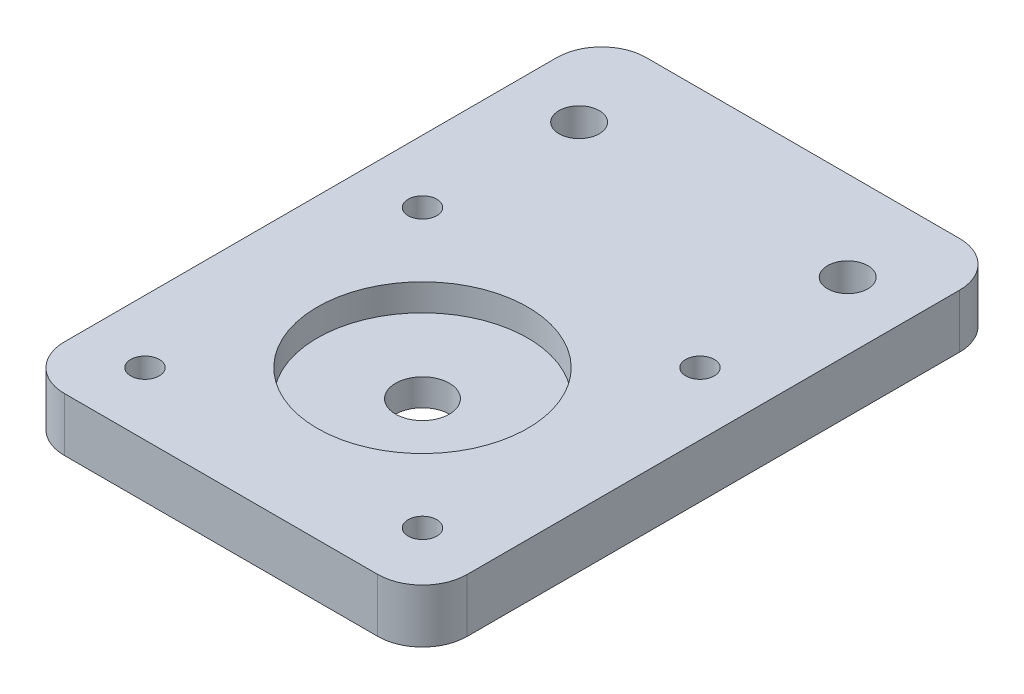
ISO-10303-21;
HEADER;
FILE_DESCRIPTION(('STEP AP214'),'2;1');
FILE_NAME('part.step','',(''),(''),'','','');
FILE_SCHEMA(('AUTOMOTIVE_DESIGN { 1 0 10303 214 1 1 1 1 }'));
ENDSEC;
DATA;
#1=APPLICATION_CONTEXT('core data for automotive mechanical design processes');
#2=APPLICATION_PROTOCOL_DEFINITION('international standard','automotive_design',2000,#1);
#3=PRODUCT_CONTEXT('',#1,'mechanical');
#4=PRODUCT('Part','Part','',(#3));
#5=PRODUCT_RELATED_PRODUCT_CATEGORY('part','',(#4));
#6=PRODUCT_DEFINITION_FORMATION('','',#4);
#7=PRODUCT_DEFINITION_CONTEXT('part definition',#1,'design');
#8=PRODUCT_DEFINITION('design','',#6,#7);
#9=PRODUCT_DEFINITION_SHAPE('','',#8);
#10=(LENGTH_UNIT() NAMED_UNIT(*) SI_UNIT(.MILLI.,.METRE.));
#11=(NAMED_UNIT(*) PLANE_ANGLE_UNIT() SI_UNIT($,.RADIAN.));
#12=(NAMED_UNIT(*) SI_UNIT($,.STERADIAN.) SOLID_ANGLE_UNIT());
#13=UNCERTAINTY_MEASURE_WITH_UNIT(LENGTH_MEASURE(1.E-05),#10,'distance_accuracy_value','');
#14=(GEOMETRIC_REPRESENTATION_CONTEXT(3) GLOBAL_UNCERTAINTY_ASSIGNED_CONTEXT((#13)) GLOBAL_UNIT_ASSIGNED_CONTEXT((#10,
#11,#12)) REPRESENTATION_CONTEXT('',''));
#15=CARTESIAN_POINT('',(0.,0.,0.));
#16=DIRECTION('',(0.,0.,1.));
#17=DIRECTION('',(1.,0.,0.));
#18=AXIS2_PLACEMENT_3D('',#15,#16,#17);
#19=CARTESIAN_POINT('',(0.,6.,0.));
#20=DIRECTION('',(0.,-1.,0.));
#21=DIRECTION('',(0.,0.,-1.));
#22=AXIS2_PLACEMENT_3D('',#19,#20,#21);
#23=CYLINDRICAL_SURFACE('',#22,3.);
#24=CARTESIAN_POINT('',(0.,0.,0.));
#25=DIRECTION('',(0.,1.,0.));
#26=DIRECTION('',(0.,0.,1.));
#27=AXIS2_PLACEMENT_3D('',#24,#25,#26);
#28=CIRCLE('',#27,3.);
#29=CARTESIAN_POINT('',(0.,0.,3.));
#30=VERTEX_POINT('',#29);
#31=EDGE_CURVE('E132',#30,#30,#28,.T.);
#32=ORIENTED_EDGE('',*,*,#31,.F.);
#33=EDGE_LOOP('',(#32));
#34=FACE_BOUND('',#33,.T.);
#35=CARTESIAN_POINT('',(0.,3.,0.));
#36=DIRECTION('',(0.,1.,0.));
#37=DIRECTION('',(0.,0.,1.));
#38=AXIS2_PLACEMENT_3D('',#35,#36,#37);
#39=CIRCLE('',#38,3.);
#40=CARTESIAN_POINT('',(0.,3.,3.));
#41=VERTEX_POINT('',#40);
#42=EDGE_CURVE('E144',#41,#41,#39,.T.);
#43=ORIENTED_EDGE('',*,*,#42,.T.);
#44=EDGE_LOOP('',(#43));
#45=FACE_BOUND('',#44,.T.);
#46=ADVANCED_FACE('F36',(#34,#45),#23,.F.);
#47=CARTESIAN_POINT('',(0.,6.,0.));
#48=DIRECTION('',(0.,-1.,0.));
#49=DIRECTION('',(0.,0.,-1.));
#50=AXIS2_PLACEMENT_3D('',#47,#48,#49);
#51=PLANE('',#50);
#52=CARTESIAN_POINT('',(0.,6.,0.));
#53=DIRECTION('',(0.,1.,0.));
#54=DIRECTION('',(0.,0.,1.));
#55=AXIS2_PLACEMENT_3D('',#52,#53,#54);
#56=CIRCLE('',#55,11.75);
#57=CARTESIAN_POINT('',(0.,6.,11.75));
#58=VERTEX_POINT('',#57);
#59=EDGE_CURVE('E216',#58,#58,#56,.T.);
#60=ORIENTED_EDGE('',*,*,#59,.F.);
#61=EDGE_LOOP('',(#60));
#62=FACE_BOUND('',#61,.T.);
#63=DIRECTION('',(1.,0.,0.));
#64=VECTOR('',#63,1.);
#65=CARTESIAN_POINT('',(-22.5,6.,22.5));
#66=LINE('',#65,#64);
#67=CARTESIAN_POINT('',(-17.5,6.,22.5));
#68=VERTEX_POINT('',#67);
#69=CARTESIAN_POINT('',(17.5,6.,22.5));
#70=VERTEX_POINT('',#69);
#71=EDGE_CURVE('E140',#68,#70,#66,.T.);
#72=ORIENTED_EDGE('',*,*,#71,.T.);
#73=CARTESIAN_POINT('',(17.5,6.,17.5));
#74=DIRECTION('',(0.,-1.,0.));
#75=DIRECTION('',(0.,0.,-1.));
#76=AXIS2_PLACEMENT_3D('',#73,#74,#75);
#77=CIRCLE('',#76,5.);
#78=CARTESIAN_POINT('',(22.5,6.,17.5));
#79=VERTEX_POINT('',#78);
#80=EDGE_CURVE('E161',#70,#79,#77,.F.);
#81=ORIENTED_EDGE('',*,*,#80,.T.);
#82=DIRECTION('',(0.,0.,-1.));
#83=VECTOR('',#82,1.);
#84=CARTESIAN_POINT('',(22.5,6.,22.5));
#85=LINE('',#84,#83);
#86=CARTESIAN_POINT('',(22.5,6.,-37.5));
#87=VERTEX_POINT('',#86);
#88=EDGE_CURVE('E123',#79,#87,#85,.T.);
#89=ORIENTED_EDGE('',*,*,#88,.T.);
#90=CARTESIAN_POINT('',(17.5,6.,-37.5));
#91=DIRECTION('',(0.,-1.,0.));
#92=DIRECTION('',(0.,0.,-1.));
#93=AXIS2_PLACEMENT_3D('',#90,#91,#92);
#94=CIRCLE('',#93,5.);
#95=CARTESIAN_POINT('',(17.5,6.,-42.5));
#96=VERTEX_POINT('',#95);
#97=EDGE_CURVE('E157',#87,#96,#94,.F.);
#98=ORIENTED_EDGE('',*,*,#97,.T.);
#99=DIRECTION('',(1.,0.,0.));
#100=VECTOR('',#99,1.);
#101=CARTESIAN_POINT('',(22.5,6.,-42.5));
#102=LINE('',#101,#100);
#103=CARTESIAN_POINT('',(-17.5,6.,-42.5));
#104=VERTEX_POINT('',#103);
#105=EDGE_CURVE('E171',#104,#96,#102,.T.);
#106=ORIENTED_EDGE('',*,*,#105,.F.);
#107=CARTESIAN_POINT('',(-17.5,6.,-37.5));
#108=DIRECTION('',(0.,-1.,0.));
#109=DIRECTION('',(0.,0.,-1.));
#110=AXIS2_PLACEMENT_3D('',#107,#108,#109);
#111=CIRCLE('',#110,5.);
#112=CARTESIAN_POINT('',(-22.5,6.,-37.5));
#113=VERTEX_POINT('',#112);
#114=EDGE_CURVE('E58',#104,#113,#111,.F.);
#115=ORIENTED_EDGE('',*,*,#114,.T.);
#116=DIRECTION('',(0.,0.,1.));
#117=VECTOR('',#116,1.);
#118=CARTESIAN_POINT('',(-22.5,6.,22.5));
#119=LINE('',#118,#117);
#120=CARTESIAN_POINT('',(-22.5,6.,17.5));
#121=VERTEX_POINT('',#120);
#122=EDGE_CURVE('E184',#113,#121,#119,.T.);
#123=ORIENTED_EDGE('',*,*,#122,.T.);
#124=CARTESIAN_POINT('',(-17.5,6.,17.5));
#125=DIRECTION('',(0.,-1.,0.));
#126=DIRECTION('',(0.,0.,-1.));
#127=AXIS2_PLACEMENT_3D('',#124,#125,#126);
#128=CIRCLE('',#127,5.);
#129=EDGE_CURVE('E159',#121,#68,#128,.F.);
#130=ORIENTED_EDGE('',*,*,#129,.T.);
#131=EDGE_LOOP('',(#72,#81,#89,#98,#106,#115,#123,#130));
#132=FACE_BOUND('',#131,.T.);
#133=CARTESIAN_POINT('',(-15.5004877503902,6.,-15.5004877503904));
#134=DIRECTION('',(0.,1.,0.));
#135=DIRECTION('',(0.,0.,1.));
#136=AXIS2_PLACEMENT_3D('',#133,#134,#135);
#137=CIRCLE('',#136,1.59999999999999);
#138=CARTESIAN_POINT('',(-15.5004877503902,6.,-13.9004877503904));
#139=VERTEX_POINT('',#138);
#140=EDGE_CURVE('E137',#139,#139,#137,.T.);
#141=ORIENTED_EDGE('',*,*,#140,.F.);
#142=EDGE_LOOP('',(#141));
#143=FACE_BOUND('',#142,.T.);
#144=CARTESIAN_POINT('',(15.5004877503904,6.,-15.5004877503911));
#145=DIRECTION('',(0.,1.,0.));
#146=DIRECTION('',(0.,0.,1.));
#147=AXIS2_PLACEMENT_3D('',#144,#145,#146);
#148=CIRCLE('',#147,1.60000000000091);
#149=CARTESIAN_POINT('',(15.5004877503904,6.,-13.9004877503902));
#150=VERTEX_POINT('',#149);
#151=EDGE_CURVE('E197',#150,#150,#148,.T.);
#152=ORIENTED_EDGE('',*,*,#151,.F.);
#153=EDGE_LOOP('',(#152));
#154=FACE_BOUND('',#153,.T.);
#155=CARTESIAN_POINT('',(15.5004877503911,6.,15.5004877503895));
#156=DIRECTION('',(0.,1.,0.));
#157=DIRECTION('',(0.,0.,1.));
#158=AXIS2_PLACEMENT_3D('',#155,#156,#157);
#159=CIRCLE('',#158,1.60000000000123);
#160=CARTESIAN_POINT('',(15.5004877503911,6.,17.1004877503907));
#161=VERTEX_POINT('',#160);
#162=EDGE_CURVE('E203',#161,#161,#159,.T.);
#163=ORIENTED_EDGE('',*,*,#162,.F.);
#164=EDGE_LOOP('',(#163));
#165=FACE_BOUND('',#164,.T.);
#166=CARTESIAN_POINT('',(-15.5004877503895,6.,15.5004877503902));
#167=DIRECTION('',(0.,1.,0.));
#168=DIRECTION('',(0.,0.,1.));
#169=AXIS2_PLACEMENT_3D('',#166,#167,#168);
#170=CIRCLE('',#169,1.60000000000046);
#171=CARTESIAN_POINT('',(-15.5004877503895,6.,17.1004877503907));
#172=VERTEX_POINT('',#171);
#173=EDGE_CURVE('E209',#172,#172,#170,.T.);
#174=ORIENTED_EDGE('',*,*,#173,.F.);
#175=EDGE_LOOP('',(#174));
#176=FACE_BOUND('',#175,.T.);
#177=CARTESIAN_POINT('',(15.,6.,-32.5));
#178=DIRECTION('',(0.,-1.,0.));
#179=DIRECTION('',(0.,0.,-1.));
#180=AXIS2_PLACEMENT_3D('',#177,#178,#179);
#181=CIRCLE('',#180,2.25);
#182=CARTESIAN_POINT('',(15.,6.,-34.75));
#183=VERTEX_POINT('',#182);
#184=EDGE_CURVE('E222',#183,#183,#181,.T.);
#185=ORIENTED_EDGE('',*,*,#184,.T.);
#186=EDGE_LOOP('',(#185));
#187=FACE_BOUND('',#186,.T.);
#188=CARTESIAN_POINT('',(-15.,6.,-32.5));
#189=DIRECTION('',(0.,-1.,0.));
#190=DIRECTION('',(0.,0.,-1.));
#191=AXIS2_PLACEMENT_3D('',#188,#189,#190);
#192=CIRCLE('',#191,2.25);
#193=CARTESIAN_POINT('',(-15.,6.,-34.75));
#194=VERTEX_POINT('',#193);
#195=EDGE_CURVE('E219',#194,#194,#192,.T.);
#196=ORIENTED_EDGE('',*,*,#195,.T.);
#197=EDGE_LOOP('',(#196));
#198=FACE_BOUND('',#197,.T.);
#199=ADVANCED_FACE('F176',(#62,#132,#143,#154,#165,#176,#187,#198),#51,.F.);
#200=CARTESIAN_POINT('',(0.,0.,0.));
#201=DIRECTION('',(0.,-1.,0.));
#202=DIRECTION('',(0.,0.,-1.));
#203=AXIS2_PLACEMENT_3D('',#200,#201,#202);
#204=PLANE('',#203);
#205=CARTESIAN_POINT('',(15.5004877503911,0.,15.5004877503895));
#206=DIRECTION('',(0.,1.,0.));
#207=DIRECTION('',(0.,0.,1.));
#208=AXIS2_PLACEMENT_3D('',#205,#206,#207);
#209=CIRCLE('',#208,1.60000000000123);
#210=CARTESIAN_POINT('',(15.5004877503911,0.,17.1004877503907));
#211=VERTEX_POINT('',#210);
#212=EDGE_CURVE('E206',#211,#211,#209,.T.);
#213=ORIENTED_EDGE('',*,*,#212,.T.);
#214=EDGE_LOOP('',(#213));
#215=FACE_BOUND('',#214,.T.);
#216=CARTESIAN_POINT('',(-15.5004877503902,0.,-15.5004877503904));
#217=DIRECTION('',(0.,1.,0.));
#218=DIRECTION('',(0.,0.,1.));
#219=AXIS2_PLACEMENT_3D('',#216,#217,#218);
#220=CIRCLE('',#219,1.59999999999999);
#221=CARTESIAN_POINT('',(-15.5004877503902,0.,-13.9004877503904));
#222=VERTEX_POINT('',#221);
#223=EDGE_CURVE('E194',#222,#222,#220,.T.);
#224=ORIENTED_EDGE('',*,*,#223,.T.);
#225=EDGE_LOOP('',(#224));
#226=FACE_BOUND('',#225,.T.);
#227=DIRECTION('',(0.,0.,-1.));
#228=VECTOR('',#227,1.);
#229=CARTESIAN_POINT('',(22.5,0.,22.5));
#230=LINE('',#229,#228);
#231=CARTESIAN_POINT('',(22.5,0.,17.5));
#232=VERTEX_POINT('',#231);
#233=CARTESIAN_POINT('',(22.5,0.,-37.5));
#234=VERTEX_POINT('',#233);
#235=EDGE_CURVE('E120',#232,#234,#230,.T.);
#236=ORIENTED_EDGE('',*,*,#235,.F.);
#237=CARTESIAN_POINT('',(17.5,0.,17.5));
#238=DIRECTION('',(0.,-1.,0.));
#239=DIRECTION('',(0.,0.,-1.));
#240=AXIS2_PLACEMENT_3D('',#237,#238,#239);
#241=CIRCLE('',#240,5.);
#242=CARTESIAN_POINT('',(17.5,0.,22.5));
#243=VERTEX_POINT('',#242);
#244=EDGE_CURVE('E103',#232,#243,#241,.T.);
#245=ORIENTED_EDGE('',*,*,#244,.T.);
#246=DIRECTION('',(1.,0.,0.));
#247=VECTOR('',#246,1.);
#248=CARTESIAN_POINT('',(-22.5,0.,22.5));
#249=LINE('',#248,#247);
#250=CARTESIAN_POINT('',(-17.5,0.,22.5));
#251=VERTEX_POINT('',#250);
#252=EDGE_CURVE('E134',#251,#243,#249,.T.);
#253=ORIENTED_EDGE('',*,*,#252,.F.);
#254=CARTESIAN_POINT('',(-17.5,0.,17.5));
#255=DIRECTION('',(0.,-1.,0.));
#256=DIRECTION('',(0.,0.,-1.));
#257=AXIS2_PLACEMENT_3D('',#254,#255,#256);
#258=CIRCLE('',#257,5.);
#259=CARTESIAN_POINT('',(-22.5,0.,17.5));
#260=VERTEX_POINT('',#259);
#261=EDGE_CURVE('E114',#251,#260,#258,.T.);
#262=ORIENTED_EDGE('',*,*,#261,.T.);
#263=DIRECTION('',(0.,0.,1.));
#264=VECTOR('',#263,1.);
#265=CARTESIAN_POINT('',(-22.5,0.,22.5));
#266=LINE('',#265,#264);
#267=CARTESIAN_POINT('',(-22.5,0.,-37.5));
#268=VERTEX_POINT('',#267);
#269=EDGE_CURVE('E131',#268,#260,#266,.T.);
#270=ORIENTED_EDGE('',*,*,#269,.F.);
#271=CARTESIAN_POINT('',(-17.5,0.,-37.5));
#272=DIRECTION('',(0.,-1.,0.));
#273=DIRECTION('',(0.,0.,-1.));
#274=AXIS2_PLACEMENT_3D('',#271,#272,#273);
#275=CIRCLE('',#274,5.);
#276=CARTESIAN_POINT('',(-17.5,0.,-42.5));
#277=VERTEX_POINT('',#276);
#278=EDGE_CURVE('E124',#268,#277,#275,.T.);
#279=ORIENTED_EDGE('',*,*,#278,.T.);
#280=DIRECTION('',(-1.,0.,0.));
#281=VECTOR('',#280,1.);
#282=CARTESIAN_POINT('',(22.5,0.,-42.5));
#283=LINE('',#282,#281);
#284=CARTESIAN_POINT('',(17.5,0.,-42.5));
#285=VERTEX_POINT('',#284);
#286=EDGE_CURVE('E173',#285,#277,#283,.T.);
#287=ORIENTED_EDGE('',*,*,#286,.F.);
#288=CARTESIAN_POINT('',(17.5,0.,-37.5));
#289=DIRECTION('',(0.,-1.,0.));
#290=DIRECTION('',(0.,0.,-1.));
#291=AXIS2_PLACEMENT_3D('',#288,#289,#290);
#292=CIRCLE('',#291,5.);
#293=EDGE_CURVE('E130',#285,#234,#292,.T.);
#294=ORIENTED_EDGE('',*,*,#293,.T.);
#295=EDGE_LOOP('',(#236,#245,#253,#262,#270,#279,#287,#294));
#296=FACE_BOUND('',#295,.T.);
#297=ORIENTED_EDGE('',*,*,#31,.T.);
#298=EDGE_LOOP('',(#297));
#299=FACE_BOUND('',#298,.T.);
#300=CARTESIAN_POINT('',(15.5004877503904,0.,-15.5004877503911));
#301=DIRECTION('',(0.,1.,0.));
#302=DIRECTION('',(0.,0.,1.));
#303=AXIS2_PLACEMENT_3D('',#300,#301,#302);
#304=CIRCLE('',#303,1.60000000000091);
#305=CARTESIAN_POINT('',(15.5004877503904,0.,-13.9004877503902));
#306=VERTEX_POINT('',#305);
#307=EDGE_CURVE('E200',#306,#306,#304,.T.);
#308=ORIENTED_EDGE('',*,*,#307,.T.);
#309=EDGE_LOOP('',(#308));
#310=FACE_BOUND('',#309,.T.);
#311=CARTESIAN_POINT('',(-15.5004877503895,0.,15.5004877503902));
#312=DIRECTION('',(0.,1.,0.));
#313=DIRECTION('',(0.,0.,1.));
#314=AXIS2_PLACEMENT_3D('',#311,#312,#313);
#315=CIRCLE('',#314,1.60000000000046);
#316=CARTESIAN_POINT('',(-15.5004877503895,0.,17.1004877503907));
#317=VERTEX_POINT('',#316);
#318=EDGE_CURVE('E147',#317,#317,#315,.T.);
#319=ORIENTED_EDGE('',*,*,#318,.T.);
#320=EDGE_LOOP('',(#319));
#321=FACE_BOUND('',#320,.T.);
#322=CARTESIAN_POINT('',(-15.,0.,-32.5));
#323=DIRECTION('',(0.,1.,0.));
#324=DIRECTION('',(0.,0.,1.));
#325=AXIS2_PLACEMENT_3D('',#322,#323,#324);
#326=CIRCLE('',#325,2.25);
#327=CARTESIAN_POINT('',(-15.,0.,-30.25));
#328=VERTEX_POINT('',#327);
#329=EDGE_CURVE('E229',#328,#328,#326,.T.);
#330=ORIENTED_EDGE('',*,*,#329,.T.);
#331=EDGE_LOOP('',(#330));
#332=FACE_BOUND('',#331,.T.);
#333=CARTESIAN_POINT('',(15.,0.,-32.5));
#334=DIRECTION('',(0.,1.,0.));
#335=DIRECTION('',(0.,0.,-1.));
#336=AXIS2_PLACEMENT_3D('',#333,#334,#335);
#337=CIRCLE('',#336,2.25);
#338=CARTESIAN_POINT('',(15.,0.,-34.75));
#339=VERTEX_POINT('',#338);
#340=EDGE_CURVE('E179',#339,#339,#337,.T.);
#341=ORIENTED_EDGE('',*,*,#340,.T.);
#342=EDGE_LOOP('',(#341));
#343=FACE_BOUND('',#342,.T.);
#344=ADVANCED_FACE('F127',(#215,#226,#296,#299,#310,#321,#332,#343),#204,.T.);
#345=CARTESIAN_POINT('',(22.5,6.,22.5));
#346=DIRECTION('',(-1.,0.,0.));
#347=DIRECTION('',(0.,0.,1.));
#348=AXIS2_PLACEMENT_3D('',#345,#346,#347);
#349=PLANE('',#348);
#350=ORIENTED_EDGE('',*,*,#88,.F.);
#351=DIRECTION('',(0.,-1.,0.));
#352=VECTOR('',#351,1.);
#353=CARTESIAN_POINT('',(22.5,6.,17.5));
#354=LINE('',#353,#352);
#355=EDGE_CURVE('E107',#79,#232,#354,.T.);
#356=ORIENTED_EDGE('',*,*,#355,.T.);
#357=ORIENTED_EDGE('',*,*,#235,.T.);
#358=DIRECTION('',(0.,-1.,0.));
#359=VECTOR('',#358,1.);
#360=CARTESIAN_POINT('',(22.5,6.,-37.5));
#361=LINE('',#360,#359);
#362=EDGE_CURVE('E125',#234,#87,#361,.F.);
#363=ORIENTED_EDGE('',*,*,#362,.T.);
#364=EDGE_LOOP('',(#350,#356,#357,#363));
#365=FACE_BOUND('',#364,.T.);
#366=ADVANCED_FACE('F119',(#365),#349,.F.);
#367=CARTESIAN_POINT('',(-22.5,6.,22.5));
#368=DIRECTION('',(1.,0.,0.));
#369=DIRECTION('',(0.,0.,-1.));
#370=AXIS2_PLACEMENT_3D('',#367,#368,#369);
#371=PLANE('',#370);
#372=ORIENTED_EDGE('',*,*,#269,.T.);
#373=DIRECTION('',(0.,-1.,0.));
#374=VECTOR('',#373,1.);
#375=CARTESIAN_POINT('',(-22.5,6.,17.5));
#376=LINE('',#375,#374);
#377=EDGE_CURVE('E51',#260,#121,#376,.F.);
#378=ORIENTED_EDGE('',*,*,#377,.T.);
#379=ORIENTED_EDGE('',*,*,#122,.F.);
#380=DIRECTION('',(0.,-1.,0.));
#381=VECTOR('',#380,1.);
#382=CARTESIAN_POINT('',(-22.5,6.,-37.5));
#383=LINE('',#382,#381);
#384=EDGE_CURVE('E163',#113,#268,#383,.T.);
#385=ORIENTED_EDGE('',*,*,#384,.T.);
#386=EDGE_LOOP('',(#372,#378,#379,#385));
#387=FACE_BOUND('',#386,.T.);
#388=ADVANCED_FACE('F183',(#387),#371,.F.);
#389=CARTESIAN_POINT('',(-22.5,6.,22.5));
#390=DIRECTION('',(0.,0.,-1.));
#391=DIRECTION('',(-1.,0.,0.));
#392=AXIS2_PLACEMENT_3D('',#389,#390,#391);
#393=PLANE('',#392);
#394=ORIENTED_EDGE('',*,*,#252,.T.);
#395=DIRECTION('',(0.,-1.,0.));
#396=VECTOR('',#395,1.);
#397=CARTESIAN_POINT('',(17.5,6.,22.5));
#398=LINE('',#397,#396);
#399=EDGE_CURVE('E108',#243,#70,#398,.F.);
#400=ORIENTED_EDGE('',*,*,#399,.T.);
#401=ORIENTED_EDGE('',*,*,#71,.F.);
#402=DIRECTION('',(0.,-1.,0.));
#403=VECTOR('',#402,1.);
#404=CARTESIAN_POINT('',(-17.5,6.,22.5));
#405=LINE('',#404,#403);
#406=EDGE_CURVE('E113',#68,#251,#405,.T.);
#407=ORIENTED_EDGE('',*,*,#406,.T.);
#408=EDGE_LOOP('',(#394,#400,#401,#407));
#409=FACE_BOUND('',#408,.T.);
#410=ADVANCED_FACE('F191',(#409),#393,.F.);
#411=CARTESIAN_POINT('',(-15.5004877503902,6.,-15.5004877503904));
#412=DIRECTION('',(0.,-1.,0.));
#413=DIRECTION('',(0.,0.,-1.));
#414=AXIS2_PLACEMENT_3D('',#411,#412,#413);
#415=CYLINDRICAL_SURFACE('',#414,1.59999999999999);
#416=ORIENTED_EDGE('',*,*,#140,.T.);
#417=EDGE_LOOP('',(#416));
#418=FACE_BOUND('',#417,.T.);
#419=ORIENTED_EDGE('',*,*,#223,.F.);
#420=EDGE_LOOP('',(#419));
#421=FACE_BOUND('',#420,.T.);
#422=ADVANCED_FACE('F261',(#418,#421),#415,.F.);
#423=CARTESIAN_POINT('',(15.5004877503904,6.,-15.5004877503911));
#424=DIRECTION('',(0.,-1.,0.));
#425=DIRECTION('',(0.,0.,-1.));
#426=AXIS2_PLACEMENT_3D('',#423,#424,#425);
#427=CYLINDRICAL_SURFACE('',#426,1.60000000000091);
#428=ORIENTED_EDGE('',*,*,#151,.T.);
#429=EDGE_LOOP('',(#428));
#430=FACE_BOUND('',#429,.T.);
#431=ORIENTED_EDGE('',*,*,#307,.F.);
#432=EDGE_LOOP('',(#431));
#433=FACE_BOUND('',#432,.T.);
#434=ADVANCED_FACE('F395',(#430,#433),#427,.F.);
#435=CARTESIAN_POINT('',(15.5004877503911,6.,15.5004877503895));
#436=DIRECTION('',(0.,-1.,0.));
#437=DIRECTION('',(0.,0.,-1.));
#438=AXIS2_PLACEMENT_3D('',#435,#436,#437);
#439=CYLINDRICAL_SURFACE('',#438,1.60000000000123);
#440=ORIENTED_EDGE('',*,*,#162,.T.);
#441=EDGE_LOOP('',(#440));
#442=FACE_BOUND('',#441,.T.);
#443=ORIENTED_EDGE('',*,*,#212,.F.);
#444=EDGE_LOOP('',(#443));
#445=FACE_BOUND('',#444,.T.);
#446=ADVANCED_FACE('F385',(#442,#445),#439,.F.);
#447=CARTESIAN_POINT('',(-15.5004877503895,6.,15.5004877503902));
#448=DIRECTION('',(0.,-1.,0.));
#449=DIRECTION('',(0.,0.,-1.));
#450=AXIS2_PLACEMENT_3D('',#447,#448,#449);
#451=CYLINDRICAL_SURFACE('',#450,1.60000000000046);
#452=ORIENTED_EDGE('',*,*,#173,.T.);
#453=EDGE_LOOP('',(#452));
#454=FACE_BOUND('',#453,.T.);
#455=ORIENTED_EDGE('',*,*,#318,.F.);
#456=EDGE_LOOP('',(#455));
#457=FACE_BOUND('',#456,.T.);
#458=ADVANCED_FACE('F370',(#454,#457),#451,.F.);
#459=CARTESIAN_POINT('',(0.,3.,0.));
#460=DIRECTION('',(0.,1.,0.));
#461=DIRECTION('',(0.,0.,1.));
#462=AXIS2_PLACEMENT_3D('',#459,#460,#461);
#463=CYLINDRICAL_SURFACE('',#462,11.75);
#464=CARTESIAN_POINT('',(0.,3.,0.));
#465=DIRECTION('',(0.,1.,0.));
#466=DIRECTION('',(0.,0.,1.));
#467=AXIS2_PLACEMENT_3D('',#464,#465,#466);
#468=CIRCLE('',#467,11.75);
#469=CARTESIAN_POINT('',(0.,3.,11.75));
#470=VERTEX_POINT('',#469);
#471=EDGE_CURVE('E148',#470,#470,#468,.T.);
#472=ORIENTED_EDGE('',*,*,#471,.F.);
#473=EDGE_LOOP('',(#472));
#474=FACE_BOUND('',#473,.T.);
#475=ORIENTED_EDGE('',*,*,#59,.T.);
#476=EDGE_LOOP('',(#475));
#477=FACE_BOUND('',#476,.T.);
#478=ADVANCED_FACE('F361',(#474,#477),#463,.F.);
#479=CARTESIAN_POINT('',(0.,3.,0.));
#480=DIRECTION('',(0.,1.,0.));
#481=DIRECTION('',(0.,0.,1.));
#482=AXIS2_PLACEMENT_3D('',#479,#480,#481);
#483=PLANE('',#482);
#484=ORIENTED_EDGE('',*,*,#42,.F.);
#485=EDGE_LOOP('',(#484));
#486=FACE_BOUND('',#485,.T.);
#487=ORIENTED_EDGE('',*,*,#471,.T.);
#488=EDGE_LOOP('',(#487));
#489=FACE_BOUND('',#488,.T.);
#490=ADVANCED_FACE('F247',(#486,#489),#483,.T.);
#491=CARTESIAN_POINT('',(22.5,55.2442890089805,-42.5));
#492=DIRECTION('',(0.,0.,1.));
#493=DIRECTION('',(1.,0.,0.));
#494=AXIS2_PLACEMENT_3D('',#491,#492,#493);
#495=PLANE('',#494);
#496=ORIENTED_EDGE('',*,*,#105,.T.);
#497=DIRECTION('',(0.,-1.,0.));
#498=VECTOR('',#497,1.);
#499=CARTESIAN_POINT('',(17.5,55.2442890089805,-42.5));
#500=LINE('',#499,#498);
#501=EDGE_CURVE('E11',#96,#285,#500,.T.);
#502=ORIENTED_EDGE('',*,*,#501,.T.);
#503=ORIENTED_EDGE('',*,*,#286,.T.);
#504=DIRECTION('',(0.,-1.,0.));
#505=VECTOR('',#504,1.);
#506=CARTESIAN_POINT('',(-17.5,55.2442890089805,-42.5));
#507=LINE('',#506,#505);
#508=EDGE_CURVE('E44',#277,#104,#507,.F.);
#509=ORIENTED_EDGE('',*,*,#508,.T.);
#510=EDGE_LOOP('',(#496,#502,#503,#509));
#511=FACE_BOUND('',#510,.T.);
#512=ADVANCED_FACE('F170',(#511),#495,.F.);
#513=CARTESIAN_POINT('',(-15.,55.2442890089805,-32.5));
#514=DIRECTION('',(0.,-1.,0.));
#515=DIRECTION('',(0.,0.,-1.));
#516=AXIS2_PLACEMENT_3D('',#513,#514,#515);
#517=CYLINDRICAL_SURFACE('',#516,2.25);
#518=ORIENTED_EDGE('',*,*,#195,.F.);
#519=EDGE_LOOP('',(#518));
#520=FACE_BOUND('',#519,.T.);
#521=ORIENTED_EDGE('',*,*,#329,.F.);
#522=EDGE_LOOP('',(#521));
#523=FACE_BOUND('',#522,.T.);
#524=ADVANCED_FACE('F236',(#520,#523),#517,.F.);
#525=CARTESIAN_POINT('',(15.,55.2442890089805,-32.5));
#526=DIRECTION('',(0.,-1.,0.));
#527=DIRECTION('',(0.,0.,-1.));
#528=AXIS2_PLACEMENT_3D('',#525,#526,#527);
#529=CYLINDRICAL_SURFACE('',#528,2.25);
#530=ORIENTED_EDGE('',*,*,#184,.F.);
#531=EDGE_LOOP('',(#530));
#532=FACE_BOUND('',#531,.T.);
#533=ORIENTED_EDGE('',*,*,#340,.F.);
#534=EDGE_LOOP('',(#533));
#535=FACE_BOUND('',#534,.T.);
#536=ADVANCED_FACE('F238',(#532,#535),#529,.F.);
#537=CARTESIAN_POINT('',(17.5,6.,17.5));
#538=DIRECTION('',(0.,-1.,0.));
#539=DIRECTION('',(0.,0.,-1.));
#540=AXIS2_PLACEMENT_3D('',#537,#538,#539);
#541=CYLINDRICAL_SURFACE('',#540,5.);
#542=ORIENTED_EDGE('',*,*,#80,.F.);
#543=ORIENTED_EDGE('',*,*,#399,.F.);
#544=ORIENTED_EDGE('',*,*,#244,.F.);
#545=ORIENTED_EDGE('',*,*,#355,.F.);
#546=EDGE_LOOP('',(#542,#543,#544,#545));
#547=FACE_BOUND('',#546,.T.);
#548=ADVANCED_FACE('F106',(#547),#541,.T.);
#549=CARTESIAN_POINT('',(-17.5,6.,17.5));
#550=DIRECTION('',(0.,-1.,0.));
#551=DIRECTION('',(0.,0.,-1.));
#552=AXIS2_PLACEMENT_3D('',#549,#550,#551);
#553=CYLINDRICAL_SURFACE('',#552,5.);
#554=ORIENTED_EDGE('',*,*,#129,.F.);
#555=ORIENTED_EDGE('',*,*,#377,.F.);
#556=ORIENTED_EDGE('',*,*,#261,.F.);
#557=ORIENTED_EDGE('',*,*,#406,.F.);
#558=EDGE_LOOP('',(#554,#555,#556,#557));
#559=FACE_BOUND('',#558,.T.);
#560=ADVANCED_FACE('F188',(#559),#553,.T.);
#561=CARTESIAN_POINT('',(17.5,55.2442890089805,-37.5));
#562=DIRECTION('',(0.,-1.,0.));
#563=DIRECTION('',(0.,0.,-1.));
#564=AXIS2_PLACEMENT_3D('',#561,#562,#563);
#565=CYLINDRICAL_SURFACE('',#564,5.);
#566=ORIENTED_EDGE('',*,*,#97,.F.);
#567=ORIENTED_EDGE('',*,*,#362,.F.);
#568=ORIENTED_EDGE('',*,*,#293,.F.);
#569=ORIENTED_EDGE('',*,*,#501,.F.);
#570=EDGE_LOOP('',(#566,#567,#568,#569));
#571=FACE_BOUND('',#570,.T.);
#572=ADVANCED_FACE('F276',(#571),#565,.T.);
#573=CARTESIAN_POINT('',(-17.5,6.,-37.5));
#574=DIRECTION('',(0.,-1.,0.));
#575=DIRECTION('',(0.,0.,-1.));
#576=AXIS2_PLACEMENT_3D('',#573,#574,#575);
#577=CYLINDRICAL_SURFACE('',#576,5.);
#578=ORIENTED_EDGE('',*,*,#114,.F.);
#579=ORIENTED_EDGE('',*,*,#508,.F.);
#580=ORIENTED_EDGE('',*,*,#278,.F.);
#581=ORIENTED_EDGE('',*,*,#384,.F.);
#582=EDGE_LOOP('',(#578,#579,#580,#581));
#583=FACE_BOUND('',#582,.T.);
#584=ADVANCED_FACE('F38',(#583),#577,.T.);
#585=CLOSED_SHELL('',(#46,#199,#344,#366,#388,#410,#422,#434,#446,#458,#478,#490,#512,#524,#536,
#548,#560,#572,#584));
#586=MANIFOLD_SOLID_BREP('B2',#585);
#587=ADVANCED_BREP_SHAPE_REPRESENTATION('',(#18,#586),#14);
#588=SHAPE_DEFINITION_REPRESENTATION(#9,#587);
ENDSEC;
END-ISO-10303-21;
